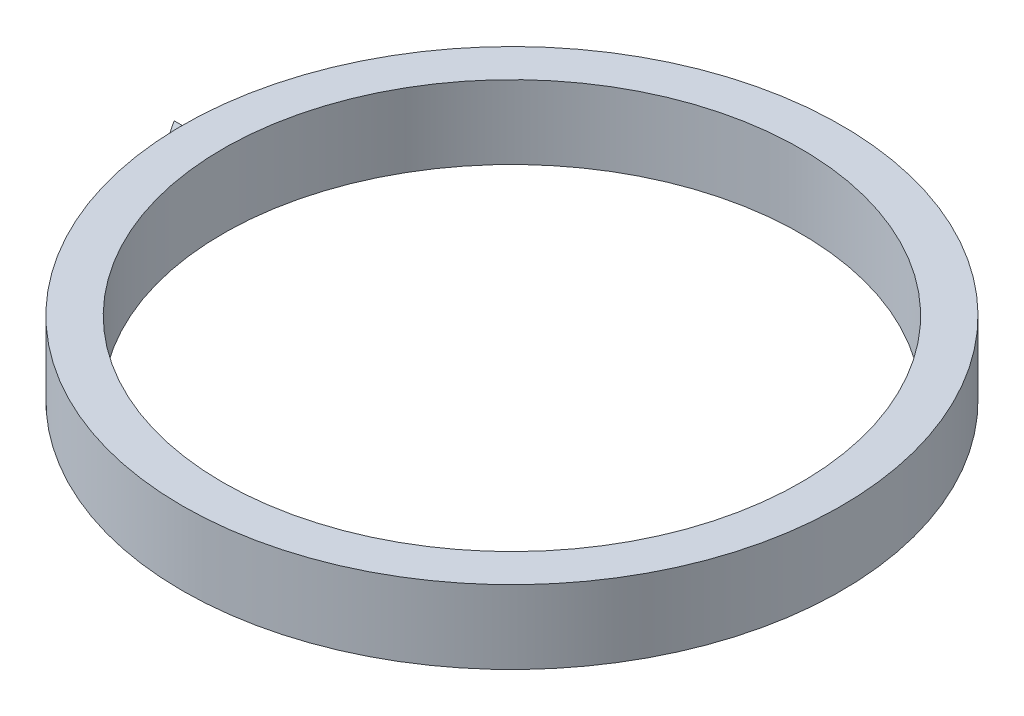
ISO-10303-21;
HEADER;
FILE_DESCRIPTION(('STEP AP214'),'2;1');
FILE_NAME('part.step','',(''),(''),'','','');
FILE_SCHEMA(('AUTOMOTIVE_DESIGN { 1 0 10303 214 1 1 1 1 }'));
ENDSEC;
DATA;
#1=APPLICATION_CONTEXT('core data for automotive mechanical design processes');
#2=APPLICATION_PROTOCOL_DEFINITION('international standard','automotive_design',2000,#1);
#3=PRODUCT_CONTEXT('',#1,'mechanical');
#4=PRODUCT('Part','Part','',(#3));
#5=PRODUCT_RELATED_PRODUCT_CATEGORY('part','',(#4));
#6=PRODUCT_DEFINITION_FORMATION('','',#4);
#7=PRODUCT_DEFINITION_CONTEXT('part definition',#1,'design');
#8=PRODUCT_DEFINITION('design','',#6,#7);
#9=PRODUCT_DEFINITION_SHAPE('','',#8);
#10=(LENGTH_UNIT() NAMED_UNIT(*) SI_UNIT(.MILLI.,.METRE.));
#11=(NAMED_UNIT(*) PLANE_ANGLE_UNIT() SI_UNIT($,.RADIAN.));
#12=(NAMED_UNIT(*) SI_UNIT($,.STERADIAN.) SOLID_ANGLE_UNIT());
#13=UNCERTAINTY_MEASURE_WITH_UNIT(LENGTH_MEASURE(1.E-05),#10,'distance_accuracy_value','');
#14=(GEOMETRIC_REPRESENTATION_CONTEXT(3) GLOBAL_UNCERTAINTY_ASSIGNED_CONTEXT((#13)) GLOBAL_UNIT_ASSIGNED_CONTEXT((#10,
#11,#12)) REPRESENTATION_CONTEXT('',''));
#15=CARTESIAN_POINT('',(0.,0.,0.));
#16=DIRECTION('',(0.,0.,1.));
#17=DIRECTION('',(1.,0.,0.));
#18=AXIS2_PLACEMENT_3D('',#15,#16,#17);
#19=CARTESIAN_POINT('',(0.,4.34782608695652,0.));
#20=DIRECTION('',(0.,-1.,0.));
#21=DIRECTION('',(0.,0.,-1.));
#22=AXIS2_PLACEMENT_3D('',#19,#20,#21);
#23=CYLINDRICAL_SURFACE('',#22,19.5);
#24=CARTESIAN_POINT('',(0.,0.,0.));
#25=DIRECTION('',(0.,1.,0.));
#26=DIRECTION('',(0.,0.,1.));
#27=AXIS2_PLACEMENT_3D('',#24,#25,#26);
#28=CIRCLE('',#27,19.5);
#29=CARTESIAN_POINT('',(0.,0.,19.5));
#30=VERTEX_POINT('',#29);
#31=EDGE_CURVE('E115',#30,#30,#28,.T.);
#32=ORIENTED_EDGE('',*,*,#31,.T.);
#33=EDGE_LOOP('',(#32));
#34=FACE_BOUND('',#33,.T.);
#35=CARTESIAN_POINT('',(0.,4.34782608695652,0.));
#36=DIRECTION('',(0.,1.,0.));
#37=DIRECTION('',(0.,0.,1.));
#38=AXIS2_PLACEMENT_3D('',#35,#36,#37);
#39=CIRCLE('',#38,19.5);
#40=CARTESIAN_POINT('',(0.,4.34782608695652,19.5));
#41=VERTEX_POINT('',#40);
#42=EDGE_CURVE('E111',#41,#41,#39,.T.);
#43=ORIENTED_EDGE('',*,*,#42,.F.);
#44=EDGE_LOOP('',(#43));
#45=FACE_BOUND('',#44,.T.);
#46=CARTESIAN_POINT('',(0.,4.33854182700951,0.));
#47=DIRECTION('',(0.,-0.448746127925553,0.893659282205373));
#48=DIRECTION('',(0.,-0.893659282205373,-0.448746127925553));
#49=AXIS2_PLACEMENT_3D('',#46,#47,#48);
#50=ELLIPSE('',#49,43.4544139470214,19.5);
#51=CARTESIAN_POINT('',(-19.5,4.33854182700951,0.));
#52=VERTEX_POINT('',#51);
#53=CARTESIAN_POINT('',(-19.4696822141464,2.17391304347826,-1.08695652173914));
#54=VERTEX_POINT('',#53);
#55=EDGE_CURVE('E91',#52,#54,#50,.T.);
#56=ORIENTED_EDGE('',*,*,#55,.F.);
#57=CARTESIAN_POINT('',(0.,4.33854182700951,0.));
#58=DIRECTION('',(0.,-0.448746127925553,-0.893659282205373));
#59=DIRECTION('',(0.,-0.893659282205373,0.448746127925553));
#60=AXIS2_PLACEMENT_3D('',#57,#58,#59);
#61=ELLIPSE('',#60,43.4544139470214,19.5);
#62=CARTESIAN_POINT('',(-19.4696822141464,2.17391304347826,1.08695652173914));
#63=VERTEX_POINT('',#62);
#64=EDGE_CURVE('E103',#63,#52,#61,.T.);
#65=ORIENTED_EDGE('',*,*,#64,.F.);
#66=CARTESIAN_POINT('',(0.,0.00928425994700752,0.));
#67=DIRECTION('',(0.,0.448746127925553,-0.893659282205373));
#68=DIRECTION('',(0.,-0.893659282205373,-0.448746127925553));
#69=AXIS2_PLACEMENT_3D('',#66,#67,#68);
#70=ELLIPSE('',#69,43.4544139470214,19.5);
#71=CARTESIAN_POINT('',(-19.5,0.00928425994700806,0.));
#72=VERTEX_POINT('',#71);
#73=EDGE_CURVE('E110',#72,#63,#70,.T.);
#74=ORIENTED_EDGE('',*,*,#73,.F.);
#75=CARTESIAN_POINT('',(0.,0.00928425994700839,0.));
#76=DIRECTION('',(0.,0.448746127925553,0.893659282205373));
#77=DIRECTION('',(0.,-0.893659282205373,0.448746127925553));
#78=AXIS2_PLACEMENT_3D('',#75,#76,#77);
#79=ELLIPSE('',#78,43.4544139470214,19.5);
#80=EDGE_CURVE('E106',#54,#72,#79,.T.);
#81=ORIENTED_EDGE('',*,*,#80,.F.);
#82=EDGE_LOOP('',(#56,#65,#74,#81));
#83=FACE_BOUND('',#82,.T.);
#84=ADVANCED_FACE('F34',(#34,#45,#83),#23,.T.);
#85=CARTESIAN_POINT('',(0.,4.34782608695652,0.));
#86=DIRECTION('',(0.,1.,0.));
#87=DIRECTION('',(0.,0.,1.));
#88=AXIS2_PLACEMENT_3D('',#85,#86,#87);
#89=PLANE('',#88);
#90=ORIENTED_EDGE('',*,*,#42,.T.);
#91=EDGE_LOOP('',(#90));
#92=FACE_BOUND('',#91,.T.);
#93=CARTESIAN_POINT('',(0.,4.34782608695652,0.));
#94=DIRECTION('',(0.,1.,0.));
#95=DIRECTION('',(0.,0.,1.));
#96=AXIS2_PLACEMENT_3D('',#93,#94,#95);
#97=CIRCLE('',#96,17.1);
#98=CARTESIAN_POINT('',(0.,4.34782608695652,17.1));
#99=VERTEX_POINT('',#98);
#100=EDGE_CURVE('E161',#99,#99,#97,.T.);
#101=ORIENTED_EDGE('',*,*,#100,.F.);
#102=EDGE_LOOP('',(#101));
#103=FACE_BOUND('',#102,.T.);
#104=ADVANCED_FACE('F179',(#92,#103),#89,.T.);
#105=CARTESIAN_POINT('',(0.,0.,0.));
#106=DIRECTION('',(0.,1.,0.));
#107=DIRECTION('',(0.,0.,1.));
#108=AXIS2_PLACEMENT_3D('',#105,#106,#107);
#109=PLANE('',#108);
#110=ORIENTED_EDGE('',*,*,#31,.F.);
#111=EDGE_LOOP('',(#110));
#112=FACE_BOUND('',#111,.T.);
#113=CARTESIAN_POINT('',(0.,0.,0.));
#114=DIRECTION('',(0.,1.,0.));
#115=DIRECTION('',(0.,0.,1.));
#116=AXIS2_PLACEMENT_3D('',#113,#114,#115);
#117=CIRCLE('',#116,17.1);
#118=CARTESIAN_POINT('',(0.,0.,17.1));
#119=VERTEX_POINT('',#118);
#120=EDGE_CURVE('E160',#119,#119,#117,.T.);
#121=ORIENTED_EDGE('',*,*,#120,.T.);
#122=EDGE_LOOP('',(#121));
#123=FACE_BOUND('',#122,.T.);
#124=ADVANCED_FACE('F167',(#112,#123),#109,.F.);
#125=CARTESIAN_POINT('',(0.,4.34782608695652,0.));
#126=DIRECTION('',(0.,-1.,0.));
#127=DIRECTION('',(0.,0.,-1.));
#128=AXIS2_PLACEMENT_3D('',#125,#126,#127);
#129=CYLINDRICAL_SURFACE('',#128,17.1);
#130=ORIENTED_EDGE('',*,*,#100,.T.);
#131=EDGE_LOOP('',(#130));
#132=FACE_BOUND('',#131,.T.);
#133=ORIENTED_EDGE('',*,*,#120,.F.);
#134=EDGE_LOOP('',(#133));
#135=FACE_BOUND('',#134,.T.);
#136=ADVANCED_FACE('F169',(#132,#135),#129,.F.);
#137=CARTESIAN_POINT('',(-20.58695652,4.33854182700951,0.));
#138=DIRECTION('',(0.,-0.448746127925553,0.893659282205373));
#139=DIRECTION('',(0.,-0.893659282205373,-0.448746127925553));
#140=AXIS2_PLACEMENT_3D('',#137,#138,#139);
#141=PLANE('',#140);
#142=DIRECTION('',(1.,0.,0.));
#143=VECTOR('',#142,1.);
#144=CARTESIAN_POINT('',(-20.58695652,2.17391304347826,-1.08695652173914));
#145=LINE('',#144,#143);
#146=CARTESIAN_POINT('',(-19.98695652,2.17391304347826,-1.08695652173914));
#147=VERTEX_POINT('',#146);
#148=EDGE_CURVE('E156',#147,#54,#145,.T.);
#149=ORIENTED_EDGE('',*,*,#148,.F.);
#150=DIRECTION('',(0.,0.893659282205373,0.448746127925553));
#151=VECTOR('',#150,1.);
#152=CARTESIAN_POINT('',(-19.98695652,4.33854182700951,0.));
#153=LINE('',#152,#151);
#154=CARTESIAN_POINT('',(-19.98695652,4.33854182700951,0.));
#155=VERTEX_POINT('',#154);
#156=EDGE_CURVE('E11',#147,#155,#153,.T.);
#157=ORIENTED_EDGE('',*,*,#156,.T.);
#158=DIRECTION('',(1.,0.,0.));
#159=VECTOR('',#158,1.);
#160=CARTESIAN_POINT('',(-20.58695652,4.33854182700951,0.));
#161=LINE('',#160,#159);
#162=EDGE_CURVE('E88',#155,#52,#161,.T.);
#163=ORIENTED_EDGE('',*,*,#162,.T.);
#164=ORIENTED_EDGE('',*,*,#55,.T.);
#165=EDGE_LOOP('',(#149,#157,#163,#164));
#166=FACE_BOUND('',#165,.T.);
#167=ADVANCED_FACE('F90',(#166),#141,.F.);
#168=CARTESIAN_POINT('',(-20.58695652,0.00928425994700806,0.));
#169=DIRECTION('',(0.,0.448746127925553,0.893659282205373));
#170=DIRECTION('',(0.,-0.893659282205373,0.448746127925553));
#171=AXIS2_PLACEMENT_3D('',#168,#169,#170);
#172=PLANE('',#171);
#173=DIRECTION('',(1.,0.,0.));
#174=VECTOR('',#173,1.);
#175=CARTESIAN_POINT('',(-20.58695652,0.00928425994700806,0.));
#176=LINE('',#175,#174);
#177=CARTESIAN_POINT('',(-19.98695652,0.00928425994700806,0.));
#178=VERTEX_POINT('',#177);
#179=EDGE_CURVE('E154',#178,#72,#176,.T.);
#180=ORIENTED_EDGE('',*,*,#179,.F.);
#181=DIRECTION('',(0.,0.893659282205373,-0.448746127925553));
#182=VECTOR('',#181,1.);
#183=CARTESIAN_POINT('',(-19.98695652,0.00928425994700806,0.));
#184=LINE('',#183,#182);
#185=EDGE_CURVE('E43',#178,#147,#184,.T.);
#186=ORIENTED_EDGE('',*,*,#185,.T.);
#187=ORIENTED_EDGE('',*,*,#148,.T.);
#188=ORIENTED_EDGE('',*,*,#80,.T.);
#189=EDGE_LOOP('',(#180,#186,#187,#188));
#190=FACE_BOUND('',#189,.T.);
#191=ADVANCED_FACE('F177',(#190),#172,.F.);
#192=CARTESIAN_POINT('',(-20.58695652,2.17391304347826,1.08695652173914));
#193=DIRECTION('',(0.,0.448746127925553,-0.893659282205373));
#194=DIRECTION('',(0.,0.893659282205373,0.448746127925553));
#195=AXIS2_PLACEMENT_3D('',#192,#193,#194);
#196=PLANE('',#195);
#197=DIRECTION('',(1.,0.,0.));
#198=VECTOR('',#197,1.);
#199=CARTESIAN_POINT('',(-20.58695652,2.17391304347826,1.08695652173914));
#200=LINE('',#199,#198);
#201=CARTESIAN_POINT('',(-19.98695652,2.17391304347826,1.08695652173914));
#202=VERTEX_POINT('',#201);
#203=EDGE_CURVE('E97',#202,#63,#200,.T.);
#204=ORIENTED_EDGE('',*,*,#203,.F.);
#205=DIRECTION('',(0.,-0.893659282205373,-0.448746127925553));
#206=VECTOR('',#205,1.);
#207=CARTESIAN_POINT('',(-19.98695652,2.17391304347826,1.08695652173914));
#208=LINE('',#207,#206);
#209=EDGE_CURVE('E58',#202,#178,#208,.T.);
#210=ORIENTED_EDGE('',*,*,#209,.T.);
#211=ORIENTED_EDGE('',*,*,#179,.T.);
#212=ORIENTED_EDGE('',*,*,#73,.T.);
#213=EDGE_LOOP('',(#204,#210,#211,#212));
#214=FACE_BOUND('',#213,.T.);
#215=ADVANCED_FACE('F153',(#214),#196,.F.);
#216=CARTESIAN_POINT('',(-20.58695652,2.17391304347826,1.08695652173914));
#217=DIRECTION('',(0.,-0.448746127925553,-0.893659282205373));
#218=DIRECTION('',(0.,0.893659282205373,-0.448746127925553));
#219=AXIS2_PLACEMENT_3D('',#216,#217,#218);
#220=PLANE('',#219);
#221=ORIENTED_EDGE('',*,*,#162,.F.);
#222=DIRECTION('',(0.,-0.893659282205373,0.448746127925553));
#223=VECTOR('',#222,1.);
#224=CARTESIAN_POINT('',(-19.98695652,2.17391304347826,1.08695652173914));
#225=LINE('',#224,#223);
#226=EDGE_CURVE('E128',#155,#202,#225,.T.);
#227=ORIENTED_EDGE('',*,*,#226,.T.);
#228=ORIENTED_EDGE('',*,*,#203,.T.);
#229=ORIENTED_EDGE('',*,*,#64,.T.);
#230=EDGE_LOOP('',(#221,#227,#228,#229));
#231=FACE_BOUND('',#230,.T.);
#232=ADVANCED_FACE('F109',(#231),#220,.F.);
#233=CARTESIAN_POINT('',(-20.58695652,0.,0.));
#234=DIRECTION('',(1.,0.,0.));
#235=DIRECTION('',(0.,0.,-1.));
#236=AXIS2_PLACEMENT_3D('',#233,#234,#235);
#237=PLANE('',#236);
#238=DIRECTION('',(0.,0.893659282205373,0.448746127925553));
#239=VECTOR('',#238,1.);
#240=CARTESIAN_POINT('',(-20.58695652,0.4376020903048,-0.871466393974626));
#241=LINE('',#240,#239);
#242=CARTESIAN_POINT('',(-20.58695652,2.17309123136023,0.));
#243=VERTEX_POINT('',#242);
#244=CARTESIAN_POINT('',(-20.58695652,2.17391304347826,0.000412668466820911));
#245=VERTEX_POINT('',#244);
#246=EDGE_CURVE('E123',#243,#245,#241,.T.);
#247=ORIENTED_EDGE('',*,*,#246,.T.);
#248=DIRECTION('',(0.,0.893659282205373,-0.448746127925553));
#249=VECTOR('',#248,1.);
#250=CARTESIAN_POINT('',(-20.58695652,0.437933071991623,0.872125530261855));
#251=LINE('',#250,#249);
#252=CARTESIAN_POINT('',(-20.58695652,2.17473485559629,0.));
#253=VERTEX_POINT('',#252);
#254=EDGE_CURVE('E125',#245,#253,#251,.T.);
#255=ORIENTED_EDGE('',*,*,#254,.T.);
#256=DIRECTION('',(0.,-0.893659282205373,-0.448746127925553));
#257=VECTOR('',#256,1.);
#258=CARTESIAN_POINT('',(-20.58695652,0.437933071991622,-0.872125530261855));
#259=LINE('',#258,#257);
#260=CARTESIAN_POINT('',(-20.58695652,2.17391304347826,-0.000412668466821087));
#261=VERTEX_POINT('',#260);
#262=EDGE_CURVE('E107',#253,#261,#259,.T.);
#263=ORIENTED_EDGE('',*,*,#262,.T.);
#264=DIRECTION('',(0.,-0.893659282205373,0.448746127925553));
#265=VECTOR('',#264,1.);
#266=CARTESIAN_POINT('',(-20.58695652,0.4376020903048,0.871466393974626));
#267=LINE('',#266,#265);
#268=EDGE_CURVE('E121',#261,#243,#267,.T.);
#269=ORIENTED_EDGE('',*,*,#268,.T.);
#270=EDGE_LOOP('',(#247,#255,#263,#269));
#271=FACE_BOUND('',#270,.T.);
#272=ADVANCED_FACE('F200',(#271),#237,.F.);
#273=CARTESIAN_POINT('',(-20.58695652,0.4376020903048,0.871466393974626));
#274=DIRECTION('',(0.850694296932989,0.235888221501768,0.469761599242021));
#275=DIRECTION('',(0.,-0.893659282205373,0.448746127925553));
#276=AXIS2_PLACEMENT_3D('',#273,#274,#275);
#277=PLANE('',#276);
#278=DIRECTION('',(-0.483403141747335,0.,0.875397853863491));
#279=VECTOR('',#278,1.);
#280=CARTESIAN_POINT('',(-20.2180737247817,2.17391304347826,-0.668424891337425));
#281=LINE('',#280,#279);
#282=EDGE_CURVE('E135',#147,#261,#281,.T.);
#283=ORIENTED_EDGE('',*,*,#282,.F.);
#284=ORIENTED_EDGE('',*,*,#185,.F.);
#285=DIRECTION('',(-0.267206623633739,0.963639258377458,0.));
#286=VECTOR('',#285,1.);
#287=CARTESIAN_POINT('',(-20.1400840454655,0.561514938476094,0.));
#288=LINE('',#287,#286);
#289=EDGE_CURVE('E38',#243,#178,#288,.F.);
#290=ORIENTED_EDGE('',*,*,#289,.F.);
#291=ORIENTED_EDGE('',*,*,#268,.F.);
#292=EDGE_LOOP('',(#283,#284,#290,#291));
#293=FACE_BOUND('',#292,.T.);
#294=ADVANCED_FACE('F36',(#293),#277,.F.);
#295=CARTESIAN_POINT('',(-20.58695652,0.4376020903048,-0.871466393974626));
#296=DIRECTION('',(0.850694296932989,0.235888221501768,-0.469761599242021));
#297=DIRECTION('',(0.,0.893659282205373,0.448746127925553));
#298=AXIS2_PLACEMENT_3D('',#295,#296,#297);
#299=PLANE('',#298);
#300=ORIENTED_EDGE('',*,*,#289,.T.);
#301=ORIENTED_EDGE('',*,*,#209,.F.);
#302=DIRECTION('',(-0.483403141747335,0.,-0.875397853863491));
#303=VECTOR('',#302,1.);
#304=CARTESIAN_POINT('',(-20.955909646358,2.17391304347826,-0.667726917516247));
#305=LINE('',#304,#303);
#306=EDGE_CURVE('E134',#245,#202,#305,.F.);
#307=ORIENTED_EDGE('',*,*,#306,.F.);
#308=ORIENTED_EDGE('',*,*,#246,.F.);
#309=EDGE_LOOP('',(#300,#301,#307,#308));
#310=FACE_BOUND('',#309,.T.);
#311=ADVANCED_FACE('F144',(#310),#299,.F.);
#312=CARTESIAN_POINT('',(-20.58695652,0.437933071991622,-0.872125530261855));
#313=DIRECTION('',(0.850694296932989,-0.235888221501768,0.469761599242021));
#314=DIRECTION('',(0.,-0.893659282205373,-0.448746127925553));
#315=AXIS2_PLACEMENT_3D('',#312,#313,#314);
#316=PLANE('',#315);
#317=ORIENTED_EDGE('',*,*,#282,.T.);
#318=ORIENTED_EDGE('',*,*,#262,.F.);
#319=DIRECTION('',(0.267206623633739,0.963639258377458,0.));
#320=VECTOR('',#319,1.);
#321=CARTESIAN_POINT('',(-21.034166987905,0.561939642026718,0.));
#322=LINE('',#321,#320);
#323=EDGE_CURVE('E132',#155,#253,#322,.F.);
#324=ORIENTED_EDGE('',*,*,#323,.F.);
#325=ORIENTED_EDGE('',*,*,#156,.F.);
#326=EDGE_LOOP('',(#317,#318,#324,#325));
#327=FACE_BOUND('',#326,.T.);
#328=ADVANCED_FACE('F149',(#327),#316,.F.);
#329=CARTESIAN_POINT('',(-20.58695652,0.437933071991622,0.872125530261855));
#330=DIRECTION('',(0.850694296932988,-0.235888221501768,-0.469761599242021));
#331=DIRECTION('',(0.,0.893659282205373,-0.448746127925553));
#332=AXIS2_PLACEMENT_3D('',#329,#330,#331);
#333=PLANE('',#332);
#334=ORIENTED_EDGE('',*,*,#306,.T.);
#335=ORIENTED_EDGE('',*,*,#226,.F.);
#336=ORIENTED_EDGE('',*,*,#323,.T.);
#337=ORIENTED_EDGE('',*,*,#254,.F.);
#338=EDGE_LOOP('',(#334,#335,#336,#337));
#339=FACE_BOUND('',#338,.T.);
#340=ADVANCED_FACE('F152',(#339),#333,.F.);
#341=CLOSED_SHELL('',(#84,#104,#124,#136,#167,#191,#215,#232,#272,#294,#311,#328,#340));
#342=MANIFOLD_SOLID_BREP('B2',#341);
#343=ADVANCED_BREP_SHAPE_REPRESENTATION('',(#18,#342),#14);
#344=SHAPE_DEFINITION_REPRESENTATION(#9,#343);
ENDSEC;
END-ISO-10303-21;
